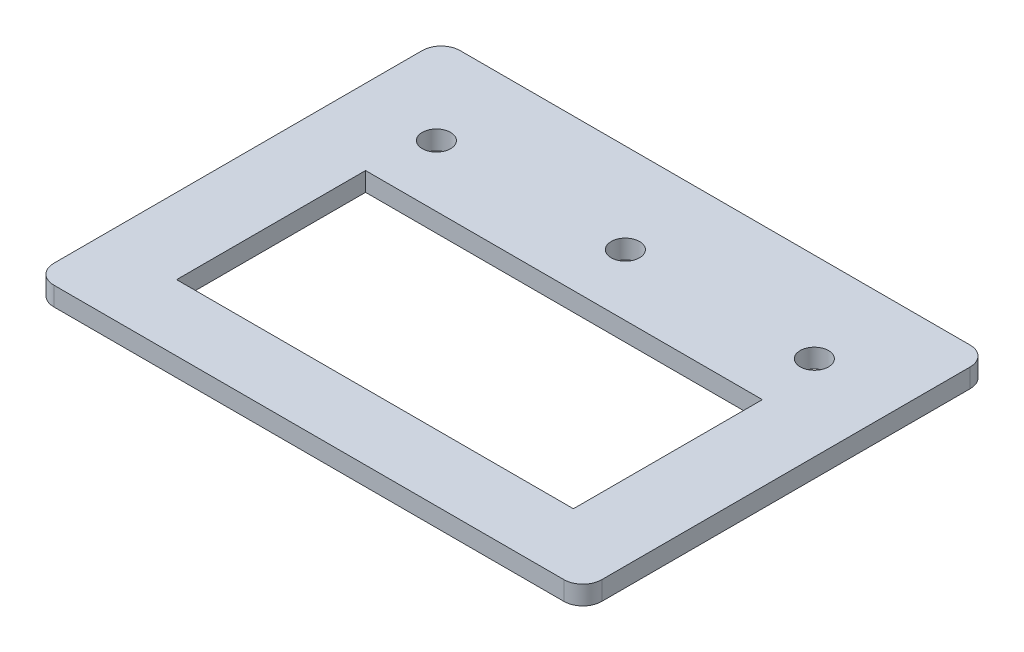
ISO-10303-21;
HEADER;
FILE_DESCRIPTION(('STEP AP214'),'2;1');
FILE_NAME('part.step','',(''),(''),'','','');
FILE_SCHEMA(('AUTOMOTIVE_DESIGN { 1 0 10303 214 1 1 1 1 }'));
ENDSEC;
DATA;
#1=APPLICATION_CONTEXT('core data for automotive mechanical design processes');
#2=APPLICATION_PROTOCOL_DEFINITION('international standard','automotive_design',2000,#1);
#3=PRODUCT_CONTEXT('',#1,'mechanical');
#4=PRODUCT('Part','Part','',(#3));
#5=PRODUCT_RELATED_PRODUCT_CATEGORY('part','',(#4));
#6=PRODUCT_DEFINITION_FORMATION('','',#4);
#7=PRODUCT_DEFINITION_CONTEXT('part definition',#1,'design');
#8=PRODUCT_DEFINITION('design','',#6,#7);
#9=PRODUCT_DEFINITION_SHAPE('','',#8);
#10=(LENGTH_UNIT() NAMED_UNIT(*) SI_UNIT(.MILLI.,.METRE.));
#11=(NAMED_UNIT(*) PLANE_ANGLE_UNIT() SI_UNIT($,.RADIAN.));
#12=(NAMED_UNIT(*) SI_UNIT($,.STERADIAN.) SOLID_ANGLE_UNIT());
#13=UNCERTAINTY_MEASURE_WITH_UNIT(LENGTH_MEASURE(1.E-05),#10,'distance_accuracy_value','');
#14=(GEOMETRIC_REPRESENTATION_CONTEXT(3) GLOBAL_UNCERTAINTY_ASSIGNED_CONTEXT((#13)) GLOBAL_UNIT_ASSIGNED_CONTEXT((#10,
#11,#12)) REPRESENTATION_CONTEXT('',''));
#15=CARTESIAN_POINT('',(0.,0.,0.));
#16=DIRECTION('',(0.,0.,1.));
#17=DIRECTION('',(1.,0.,0.));
#18=AXIS2_PLACEMENT_3D('',#15,#16,#17);
#19=CARTESIAN_POINT('',(0.,2.,0.));
#20=DIRECTION('',(0.,-1.,0.));
#21=DIRECTION('',(0.,0.,-1.));
#22=AXIS2_PLACEMENT_3D('',#19,#20,#21);
#23=PLANE('',#22);
#24=DIRECTION('',(-1.,0.,0.));
#25=VECTOR('',#24,1.);
#26=CARTESIAN_POINT('',(-29.,2.,-21.5));
#27=LINE('',#26,#25);
#28=CARTESIAN_POINT('',(27.,2.,-21.5));
#29=VERTEX_POINT('',#28);
#30=CARTESIAN_POINT('',(-27.,2.,-21.5));
#31=VERTEX_POINT('',#30);
#32=EDGE_CURVE('E190',#29,#31,#27,.T.);
#33=ORIENTED_EDGE('',*,*,#32,.T.);
#34=CARTESIAN_POINT('',(-27.,2.,-19.5));
#35=DIRECTION('',(0.,-1.,0.));
#36=DIRECTION('',(0.,0.,-1.));
#37=AXIS2_PLACEMENT_3D('',#34,#35,#36);
#38=CIRCLE('',#37,2.);
#39=CARTESIAN_POINT('',(-29.,2.,-19.5));
#40=VERTEX_POINT('',#39);
#41=EDGE_CURVE('E248',#31,#40,#38,.F.);
#42=ORIENTED_EDGE('',*,*,#41,.T.);
#43=DIRECTION('',(0.,0.,1.));
#44=VECTOR('',#43,1.);
#45=CARTESIAN_POINT('',(-29.,2.,21.5));
#46=LINE('',#45,#44);
#47=CARTESIAN_POINT('',(-29.,2.,19.5));
#48=VERTEX_POINT('',#47);
#49=EDGE_CURVE('E195',#40,#48,#46,.T.);
#50=ORIENTED_EDGE('',*,*,#49,.T.);
#51=CARTESIAN_POINT('',(-27.,2.,19.5));
#52=DIRECTION('',(0.,-1.,0.));
#53=DIRECTION('',(0.,0.,-1.));
#54=AXIS2_PLACEMENT_3D('',#51,#52,#53);
#55=CIRCLE('',#54,2.);
#56=CARTESIAN_POINT('',(-27.,2.,21.5));
#57=VERTEX_POINT('',#56);
#58=EDGE_CURVE('E60',#48,#57,#55,.F.);
#59=ORIENTED_EDGE('',*,*,#58,.T.);
#60=DIRECTION('',(1.,0.,0.));
#61=VECTOR('',#60,1.);
#62=CARTESIAN_POINT('',(-29.,2.,21.5));
#63=LINE('',#62,#61);
#64=CARTESIAN_POINT('',(27.,2.,21.5));
#65=VERTEX_POINT('',#64);
#66=EDGE_CURVE('E198',#57,#65,#63,.T.);
#67=ORIENTED_EDGE('',*,*,#66,.T.);
#68=CARTESIAN_POINT('',(27.,2.,19.5));
#69=DIRECTION('',(0.,-1.,0.));
#70=DIRECTION('',(0.,0.,-1.));
#71=AXIS2_PLACEMENT_3D('',#68,#69,#70);
#72=CIRCLE('',#71,2.);
#73=CARTESIAN_POINT('',(29.,2.,19.5));
#74=VERTEX_POINT('',#73);
#75=EDGE_CURVE('E242',#65,#74,#72,.F.);
#76=ORIENTED_EDGE('',*,*,#75,.T.);
#77=DIRECTION('',(0.,0.,-1.));
#78=VECTOR('',#77,1.);
#79=CARTESIAN_POINT('',(29.,2.,21.5));
#80=LINE('',#79,#78);
#81=CARTESIAN_POINT('',(29.,2.,-19.5));
#82=VERTEX_POINT('',#81);
#83=EDGE_CURVE('E186',#74,#82,#80,.T.);
#84=ORIENTED_EDGE('',*,*,#83,.T.);
#85=CARTESIAN_POINT('',(27.,2.,-19.5));
#86=DIRECTION('',(0.,-1.,0.));
#87=DIRECTION('',(0.,0.,-1.));
#88=AXIS2_PLACEMENT_3D('',#85,#86,#87);
#89=CIRCLE('',#88,2.);
#90=EDGE_CURVE('E245',#82,#29,#89,.F.);
#91=ORIENTED_EDGE('',*,*,#90,.T.);
#92=EDGE_LOOP('',(#33,#42,#50,#59,#67,#76,#84,#91));
#93=FACE_BOUND('',#92,.T.);
#94=DIRECTION('',(0.,0.,-1.));
#95=VECTOR('',#94,1.);
#96=CARTESIAN_POINT('',(21.,2.,-5.5));
#97=LINE('',#96,#95);
#98=CARTESIAN_POINT('',(21.,2.,14.5));
#99=VERTEX_POINT('',#98);
#100=CARTESIAN_POINT('',(21.,2.,-5.5));
#101=VERTEX_POINT('',#100);
#102=EDGE_CURVE('E130',#99,#101,#97,.T.);
#103=ORIENTED_EDGE('',*,*,#102,.F.);
#104=DIRECTION('',(1.,0.,0.));
#105=VECTOR('',#104,1.);
#106=CARTESIAN_POINT('',(-21.,2.,14.5));
#107=LINE('',#106,#105);
#108=CARTESIAN_POINT('',(-21.,2.,14.5));
#109=VERTEX_POINT('',#108);
#110=EDGE_CURVE('E160',#109,#99,#107,.T.);
#111=ORIENTED_EDGE('',*,*,#110,.F.);
#112=DIRECTION('',(0.,0.,1.));
#113=VECTOR('',#112,1.);
#114=CARTESIAN_POINT('',(-21.,2.,-5.5));
#115=LINE('',#114,#113);
#116=CARTESIAN_POINT('',(-21.,2.,-5.5));
#117=VERTEX_POINT('',#116);
#118=EDGE_CURVE('E156',#117,#109,#115,.T.);
#119=ORIENTED_EDGE('',*,*,#118,.F.);
#120=DIRECTION('',(-1.,0.,0.));
#121=VECTOR('',#120,1.);
#122=CARTESIAN_POINT('',(-21.,2.,-5.5));
#123=LINE('',#122,#121);
#124=EDGE_CURVE('E141',#101,#117,#123,.T.);
#125=ORIENTED_EDGE('',*,*,#124,.F.);
#126=EDGE_LOOP('',(#103,#111,#119,#125));
#127=FACE_BOUND('',#126,.T.);
#128=CARTESIAN_POINT('',(0.,2.,-12.));
#129=DIRECTION('',(0.,1.,0.));
#130=DIRECTION('',(0.,0.,1.));
#131=AXIS2_PLACEMENT_3D('',#128,#129,#130);
#132=CIRCLE('',#131,1.5);
#133=CARTESIAN_POINT('',(0.,2.,-10.5));
#134=VERTEX_POINT('',#133);
#135=EDGE_CURVE('E169',#134,#134,#132,.T.);
#136=ORIENTED_EDGE('',*,*,#135,.F.);
#137=EDGE_LOOP('',(#136));
#138=FACE_BOUND('',#137,.T.);
#139=CARTESIAN_POINT('',(20.,2.,-12.));
#140=DIRECTION('',(0.,1.,0.));
#141=DIRECTION('',(0.,0.,1.));
#142=AXIS2_PLACEMENT_3D('',#139,#140,#141);
#143=CIRCLE('',#142,1.5);
#144=CARTESIAN_POINT('',(20.,2.,-10.5));
#145=VERTEX_POINT('',#144);
#146=EDGE_CURVE('E448',#145,#145,#143,.T.);
#147=ORIENTED_EDGE('',*,*,#146,.F.);
#148=EDGE_LOOP('',(#147));
#149=FACE_BOUND('',#148,.T.);
#150=CARTESIAN_POINT('',(-20.,2.,-12.));
#151=DIRECTION('',(0.,1.,0.));
#152=DIRECTION('',(0.,0.,1.));
#153=AXIS2_PLACEMENT_3D('',#150,#151,#152);
#154=CIRCLE('',#153,1.5);
#155=CARTESIAN_POINT('',(-20.,2.,-10.5));
#156=VERTEX_POINT('',#155);
#157=EDGE_CURVE('E458',#156,#156,#154,.T.);
#158=ORIENTED_EDGE('',*,*,#157,.F.);
#159=EDGE_LOOP('',(#158));
#160=FACE_BOUND('',#159,.T.);
#161=ADVANCED_FACE('F39',(#93,#127,#138,#149,#160),#23,.F.);
#162=CARTESIAN_POINT('',(0.,0.,0.));
#163=DIRECTION('',(0.,-1.,0.));
#164=DIRECTION('',(0.,0.,-1.));
#165=AXIS2_PLACEMENT_3D('',#162,#163,#164);
#166=PLANE('',#165);
#167=CARTESIAN_POINT('',(20.,0.,-12.));
#168=DIRECTION('',(0.,1.,0.));
#169=DIRECTION('',(0.,0.,1.));
#170=AXIS2_PLACEMENT_3D('',#167,#168,#169);
#171=CIRCLE('',#170,1.5);
#172=CARTESIAN_POINT('',(20.,0.,-10.5));
#173=VERTEX_POINT('',#172);
#174=EDGE_CURVE('E453',#173,#173,#171,.T.);
#175=ORIENTED_EDGE('',*,*,#174,.T.);
#176=EDGE_LOOP('',(#175));
#177=FACE_BOUND('',#176,.T.);
#178=DIRECTION('',(1.,0.,0.));
#179=VECTOR('',#178,1.);
#180=CARTESIAN_POINT('',(-21.,0.,14.5));
#181=LINE('',#180,#179);
#182=CARTESIAN_POINT('',(-21.,0.,14.5));
#183=VERTEX_POINT('',#182);
#184=CARTESIAN_POINT('',(21.,0.,14.5));
#185=VERTEX_POINT('',#184);
#186=EDGE_CURVE('E142',#183,#185,#181,.T.);
#187=ORIENTED_EDGE('',*,*,#186,.T.);
#188=DIRECTION('',(0.,0.,-1.));
#189=VECTOR('',#188,1.);
#190=CARTESIAN_POINT('',(21.,0.,-5.5));
#191=LINE('',#190,#189);
#192=CARTESIAN_POINT('',(21.,0.,-5.5));
#193=VERTEX_POINT('',#192);
#194=EDGE_CURVE('E166',#185,#193,#191,.T.);
#195=ORIENTED_EDGE('',*,*,#194,.T.);
#196=DIRECTION('',(-1.,0.,0.));
#197=VECTOR('',#196,1.);
#198=CARTESIAN_POINT('',(-21.,0.,-5.5));
#199=LINE('',#198,#197);
#200=CARTESIAN_POINT('',(-21.,0.,-5.5));
#201=VERTEX_POINT('',#200);
#202=EDGE_CURVE('E148',#193,#201,#199,.T.);
#203=ORIENTED_EDGE('',*,*,#202,.T.);
#204=DIRECTION('',(0.,0.,1.));
#205=VECTOR('',#204,1.);
#206=CARTESIAN_POINT('',(-21.,0.,-5.5));
#207=LINE('',#206,#205);
#208=EDGE_CURVE('E172',#201,#183,#207,.T.);
#209=ORIENTED_EDGE('',*,*,#208,.T.);
#210=EDGE_LOOP('',(#187,#195,#203,#209));
#211=FACE_BOUND('',#210,.T.);
#212=DIRECTION('',(0.,0.,1.));
#213=VECTOR('',#212,1.);
#214=CARTESIAN_POINT('',(-29.,0.,21.5));
#215=LINE('',#214,#213);
#216=CARTESIAN_POINT('',(-29.,0.,-19.5));
#217=VERTEX_POINT('',#216);
#218=CARTESIAN_POINT('',(-29.,0.,19.5));
#219=VERTEX_POINT('',#218);
#220=EDGE_CURVE('E209',#217,#219,#215,.T.);
#221=ORIENTED_EDGE('',*,*,#220,.F.);
#222=CARTESIAN_POINT('',(-27.,0.,-19.5));
#223=DIRECTION('',(0.,-1.,0.));
#224=DIRECTION('',(0.,0.,-1.));
#225=AXIS2_PLACEMENT_3D('',#222,#223,#224);
#226=CIRCLE('',#225,2.);
#227=CARTESIAN_POINT('',(-27.,0.,-21.5));
#228=VERTEX_POINT('',#227);
#229=EDGE_CURVE('E230',#217,#228,#226,.T.);
#230=ORIENTED_EDGE('',*,*,#229,.T.);
#231=DIRECTION('',(-1.,0.,0.));
#232=VECTOR('',#231,1.);
#233=CARTESIAN_POINT('',(-29.,0.,-21.5));
#234=LINE('',#233,#232);
#235=CARTESIAN_POINT('',(27.,0.,-21.5));
#236=VERTEX_POINT('',#235);
#237=EDGE_CURVE('E205',#236,#228,#234,.T.);
#238=ORIENTED_EDGE('',*,*,#237,.F.);
#239=CARTESIAN_POINT('',(27.,0.,-19.5));
#240=DIRECTION('',(0.,-1.,0.));
#241=DIRECTION('',(0.,0.,-1.));
#242=AXIS2_PLACEMENT_3D('',#239,#240,#241);
#243=CIRCLE('',#242,2.);
#244=CARTESIAN_POINT('',(29.,0.,-19.5));
#245=VERTEX_POINT('',#244);
#246=EDGE_CURVE('E227',#236,#245,#243,.T.);
#247=ORIENTED_EDGE('',*,*,#246,.T.);
#248=DIRECTION('',(0.,0.,-1.));
#249=VECTOR('',#248,1.);
#250=CARTESIAN_POINT('',(29.,0.,21.5));
#251=LINE('',#250,#249);
#252=CARTESIAN_POINT('',(29.,0.,19.5));
#253=VERTEX_POINT('',#252);
#254=EDGE_CURVE('E150',#253,#245,#251,.T.);
#255=ORIENTED_EDGE('',*,*,#254,.F.);
#256=CARTESIAN_POINT('',(27.,0.,19.5));
#257=DIRECTION('',(0.,-1.,0.));
#258=DIRECTION('',(0.,0.,-1.));
#259=AXIS2_PLACEMENT_3D('',#256,#257,#258);
#260=CIRCLE('',#259,2.);
#261=CARTESIAN_POINT('',(27.,0.,21.5));
#262=VERTEX_POINT('',#261);
#263=EDGE_CURVE('E224',#253,#262,#260,.T.);
#264=ORIENTED_EDGE('',*,*,#263,.T.);
#265=DIRECTION('',(1.,0.,0.));
#266=VECTOR('',#265,1.);
#267=CARTESIAN_POINT('',(-29.,0.,21.5));
#268=LINE('',#267,#266);
#269=CARTESIAN_POINT('',(-27.,0.,21.5));
#270=VERTEX_POINT('',#269);
#271=EDGE_CURVE('E191',#270,#262,#268,.T.);
#272=ORIENTED_EDGE('',*,*,#271,.F.);
#273=CARTESIAN_POINT('',(-27.,0.,19.5));
#274=DIRECTION('',(0.,-1.,0.));
#275=DIRECTION('',(0.,0.,-1.));
#276=AXIS2_PLACEMENT_3D('',#273,#274,#275);
#277=CIRCLE('',#276,2.);
#278=EDGE_CURVE('E221',#270,#219,#277,.T.);
#279=ORIENTED_EDGE('',*,*,#278,.T.);
#280=EDGE_LOOP('',(#221,#230,#238,#247,#255,#264,#272,#279));
#281=FACE_BOUND('',#280,.T.);
#282=CARTESIAN_POINT('',(0.,0.,-12.));
#283=DIRECTION('',(0.,1.,0.));
#284=DIRECTION('',(0.,0.,1.));
#285=AXIS2_PLACEMENT_3D('',#282,#283,#284);
#286=CIRCLE('',#285,1.5);
#287=CARTESIAN_POINT('',(0.,0.,-10.5));
#288=VERTEX_POINT('',#287);
#289=EDGE_CURVE('E446',#288,#288,#286,.T.);
#290=ORIENTED_EDGE('',*,*,#289,.T.);
#291=EDGE_LOOP('',(#290));
#292=FACE_BOUND('',#291,.T.);
#293=CARTESIAN_POINT('',(-20.,0.,-12.));
#294=DIRECTION('',(0.,1.,0.));
#295=DIRECTION('',(0.,0.,1.));
#296=AXIS2_PLACEMENT_3D('',#293,#294,#295);
#297=CIRCLE('',#296,1.5);
#298=CARTESIAN_POINT('',(-20.,0.,-10.5));
#299=VERTEX_POINT('',#298);
#300=EDGE_CURVE('E460',#299,#299,#297,.T.);
#301=ORIENTED_EDGE('',*,*,#300,.T.);
#302=EDGE_LOOP('',(#301));
#303=FACE_BOUND('',#302,.T.);
#304=ADVANCED_FACE('F265',(#177,#211,#281,#292,#303),#166,.T.);
#305=CARTESIAN_POINT('',(29.,2.,21.5));
#306=DIRECTION('',(-1.,0.,0.));
#307=DIRECTION('',(0.,0.,1.));
#308=AXIS2_PLACEMENT_3D('',#305,#306,#307);
#309=PLANE('',#308);
#310=ORIENTED_EDGE('',*,*,#254,.T.);
#311=DIRECTION('',(0.,-1.,0.));
#312=VECTOR('',#311,1.);
#313=CARTESIAN_POINT('',(29.,2.,-19.5));
#314=LINE('',#313,#312);
#315=EDGE_CURVE('E255',#245,#82,#314,.F.);
#316=ORIENTED_EDGE('',*,*,#315,.T.);
#317=ORIENTED_EDGE('',*,*,#83,.F.);
#318=DIRECTION('',(0.,-1.,0.));
#319=VECTOR('',#318,1.);
#320=CARTESIAN_POINT('',(29.,2.,19.5));
#321=LINE('',#320,#319);
#322=EDGE_CURVE('E251',#74,#253,#321,.T.);
#323=ORIENTED_EDGE('',*,*,#322,.T.);
#324=EDGE_LOOP('',(#310,#316,#317,#323));
#325=FACE_BOUND('',#324,.T.);
#326=ADVANCED_FACE('F274',(#325),#309,.F.);
#327=CARTESIAN_POINT('',(-29.,2.,-21.5));
#328=DIRECTION('',(0.,0.,1.));
#329=DIRECTION('',(1.,0.,0.));
#330=AXIS2_PLACEMENT_3D('',#327,#328,#329);
#331=PLANE('',#330);
#332=ORIENTED_EDGE('',*,*,#237,.T.);
#333=DIRECTION('',(0.,-1.,0.));
#334=VECTOR('',#333,1.);
#335=CARTESIAN_POINT('',(-27.,2.,-21.5));
#336=LINE('',#335,#334);
#337=EDGE_CURVE('E237',#228,#31,#336,.F.);
#338=ORIENTED_EDGE('',*,*,#337,.T.);
#339=ORIENTED_EDGE('',*,*,#32,.F.);
#340=DIRECTION('',(0.,-1.,0.));
#341=VECTOR('',#340,1.);
#342=CARTESIAN_POINT('',(27.,2.,-21.5));
#343=LINE('',#342,#341);
#344=EDGE_CURVE('E233',#29,#236,#343,.T.);
#345=ORIENTED_EDGE('',*,*,#344,.T.);
#346=EDGE_LOOP('',(#332,#338,#339,#345));
#347=FACE_BOUND('',#346,.T.);
#348=ADVANCED_FACE('F283',(#347),#331,.F.);
#349=CARTESIAN_POINT('',(-29.,2.,21.5));
#350=DIRECTION('',(1.,0.,0.));
#351=DIRECTION('',(0.,0.,-1.));
#352=AXIS2_PLACEMENT_3D('',#349,#350,#351);
#353=PLANE('',#352);
#354=ORIENTED_EDGE('',*,*,#49,.F.);
#355=DIRECTION('',(0.,-1.,0.));
#356=VECTOR('',#355,1.);
#357=CARTESIAN_POINT('',(-29.,2.,-19.5));
#358=LINE('',#357,#356);
#359=EDGE_CURVE('E217',#40,#217,#358,.T.);
#360=ORIENTED_EDGE('',*,*,#359,.T.);
#361=ORIENTED_EDGE('',*,*,#220,.T.);
#362=DIRECTION('',(0.,-1.,0.));
#363=VECTOR('',#362,1.);
#364=CARTESIAN_POINT('',(-29.,2.,19.5));
#365=LINE('',#364,#363);
#366=EDGE_CURVE('E201',#219,#48,#365,.F.);
#367=ORIENTED_EDGE('',*,*,#366,.T.);
#368=EDGE_LOOP('',(#354,#360,#361,#367));
#369=FACE_BOUND('',#368,.T.);
#370=ADVANCED_FACE('F291',(#369),#353,.F.);
#371=CARTESIAN_POINT('',(-29.,2.,21.5));
#372=DIRECTION('',(0.,0.,-1.));
#373=DIRECTION('',(-1.,0.,0.));
#374=AXIS2_PLACEMENT_3D('',#371,#372,#373);
#375=PLANE('',#374);
#376=ORIENTED_EDGE('',*,*,#271,.T.);
#377=DIRECTION('',(0.,-1.,0.));
#378=VECTOR('',#377,1.);
#379=CARTESIAN_POINT('',(27.,2.,21.5));
#380=LINE('',#379,#378);
#381=EDGE_CURVE('E11',#262,#65,#380,.F.);
#382=ORIENTED_EDGE('',*,*,#381,.T.);
#383=ORIENTED_EDGE('',*,*,#66,.F.);
#384=DIRECTION('',(0.,-1.,0.));
#385=VECTOR('',#384,1.);
#386=CARTESIAN_POINT('',(-27.,2.,21.5));
#387=LINE('',#386,#385);
#388=EDGE_CURVE('E48',#57,#270,#387,.T.);
#389=ORIENTED_EDGE('',*,*,#388,.T.);
#390=EDGE_LOOP('',(#376,#382,#383,#389));
#391=FACE_BOUND('',#390,.T.);
#392=ADVANCED_FACE('F261',(#391),#375,.F.);
#393=CARTESIAN_POINT('',(21.,2.,-5.5));
#394=DIRECTION('',(-1.,0.,0.));
#395=DIRECTION('',(0.,0.,1.));
#396=AXIS2_PLACEMENT_3D('',#393,#394,#395);
#397=PLANE('',#396);
#398=ORIENTED_EDGE('',*,*,#194,.F.);
#399=DIRECTION('',(0.,-1.,0.));
#400=VECTOR('',#399,1.);
#401=CARTESIAN_POINT('',(21.,2.,14.5));
#402=LINE('',#401,#400);
#403=EDGE_CURVE('E136',#99,#185,#402,.T.);
#404=ORIENTED_EDGE('',*,*,#403,.F.);
#405=ORIENTED_EDGE('',*,*,#102,.T.);
#406=DIRECTION('',(0.,-1.,0.));
#407=VECTOR('',#406,1.);
#408=CARTESIAN_POINT('',(21.,2.,-5.5));
#409=LINE('',#408,#407);
#410=EDGE_CURVE('E133',#101,#193,#409,.T.);
#411=ORIENTED_EDGE('',*,*,#410,.T.);
#412=EDGE_LOOP('',(#398,#404,#405,#411));
#413=FACE_BOUND('',#412,.T.);
#414=ADVANCED_FACE('F132',(#413),#397,.T.);
#415=CARTESIAN_POINT('',(-21.,2.,-5.5));
#416=DIRECTION('',(0.,0.,1.));
#417=DIRECTION('',(1.,0.,0.));
#418=AXIS2_PLACEMENT_3D('',#415,#416,#417);
#419=PLANE('',#418);
#420=ORIENTED_EDGE('',*,*,#202,.F.);
#421=ORIENTED_EDGE('',*,*,#410,.F.);
#422=ORIENTED_EDGE('',*,*,#124,.T.);
#423=DIRECTION('',(0.,-1.,0.));
#424=VECTOR('',#423,1.);
#425=CARTESIAN_POINT('',(-21.,2.,-5.5));
#426=LINE('',#425,#424);
#427=EDGE_CURVE('E151',#117,#201,#426,.T.);
#428=ORIENTED_EDGE('',*,*,#427,.T.);
#429=EDGE_LOOP('',(#420,#421,#422,#428));
#430=FACE_BOUND('',#429,.T.);
#431=ADVANCED_FACE('F145',(#430),#419,.T.);
#432=CARTESIAN_POINT('',(-21.,2.,-5.5));
#433=DIRECTION('',(1.,0.,0.));
#434=DIRECTION('',(0.,0.,-1.));
#435=AXIS2_PLACEMENT_3D('',#432,#433,#434);
#436=PLANE('',#435);
#437=ORIENTED_EDGE('',*,*,#208,.F.);
#438=ORIENTED_EDGE('',*,*,#427,.F.);
#439=ORIENTED_EDGE('',*,*,#118,.T.);
#440=DIRECTION('',(0.,-1.,0.));
#441=VECTOR('',#440,1.);
#442=CARTESIAN_POINT('',(-21.,2.,14.5));
#443=LINE('',#442,#441);
#444=EDGE_CURVE('E181',#109,#183,#443,.T.);
#445=ORIENTED_EDGE('',*,*,#444,.T.);
#446=EDGE_LOOP('',(#437,#438,#439,#445));
#447=FACE_BOUND('',#446,.T.);
#448=ADVANCED_FACE('F375',(#447),#436,.T.);
#449=CARTESIAN_POINT('',(-21.,2.,14.5));
#450=DIRECTION('',(0.,0.,-1.));
#451=DIRECTION('',(-1.,0.,0.));
#452=AXIS2_PLACEMENT_3D('',#449,#450,#451);
#453=PLANE('',#452);
#454=ORIENTED_EDGE('',*,*,#186,.F.);
#455=ORIENTED_EDGE('',*,*,#444,.F.);
#456=ORIENTED_EDGE('',*,*,#110,.T.);
#457=ORIENTED_EDGE('',*,*,#403,.T.);
#458=EDGE_LOOP('',(#454,#455,#456,#457));
#459=FACE_BOUND('',#458,.T.);
#460=ADVANCED_FACE('F366',(#459),#453,.T.);
#461=CARTESIAN_POINT('',(0.,2.,-12.));
#462=DIRECTION('',(0.,-1.,0.));
#463=DIRECTION('',(0.,0.,-1.));
#464=AXIS2_PLACEMENT_3D('',#461,#462,#463);
#465=CYLINDRICAL_SURFACE('',#464,1.5);
#466=ORIENTED_EDGE('',*,*,#135,.T.);
#467=EDGE_LOOP('',(#466));
#468=FACE_BOUND('',#467,.T.);
#469=ORIENTED_EDGE('',*,*,#289,.F.);
#470=EDGE_LOOP('',(#469));
#471=FACE_BOUND('',#470,.T.);
#472=ADVANCED_FACE('F357',(#468,#471),#465,.F.);
#473=CARTESIAN_POINT('',(20.,2.,-12.));
#474=DIRECTION('',(0.,-1.,0.));
#475=DIRECTION('',(0.,0.,-1.));
#476=AXIS2_PLACEMENT_3D('',#473,#474,#475);
#477=CYLINDRICAL_SURFACE('',#476,1.5);
#478=ORIENTED_EDGE('',*,*,#146,.T.);
#479=EDGE_LOOP('',(#478));
#480=FACE_BOUND('',#479,.T.);
#481=ORIENTED_EDGE('',*,*,#174,.F.);
#482=EDGE_LOOP('',(#481));
#483=FACE_BOUND('',#482,.T.);
#484=ADVANCED_FACE('F348',(#480,#483),#477,.F.);
#485=CARTESIAN_POINT('',(-20.,2.,-12.));
#486=DIRECTION('',(0.,-1.,0.));
#487=DIRECTION('',(0.,0.,-1.));
#488=AXIS2_PLACEMENT_3D('',#485,#486,#487);
#489=CYLINDRICAL_SURFACE('',#488,1.5);
#490=ORIENTED_EDGE('',*,*,#157,.T.);
#491=EDGE_LOOP('',(#490));
#492=FACE_BOUND('',#491,.T.);
#493=ORIENTED_EDGE('',*,*,#300,.F.);
#494=EDGE_LOOP('',(#493));
#495=FACE_BOUND('',#494,.T.);
#496=ADVANCED_FACE('F317',(#492,#495),#489,.F.);
#497=CARTESIAN_POINT('',(-27.,2.,-19.5));
#498=DIRECTION('',(0.,-1.,0.));
#499=DIRECTION('',(0.,0.,-1.));
#500=AXIS2_PLACEMENT_3D('',#497,#498,#499);
#501=CYLINDRICAL_SURFACE('',#500,2.);
#502=ORIENTED_EDGE('',*,*,#41,.F.);
#503=ORIENTED_EDGE('',*,*,#337,.F.);
#504=ORIENTED_EDGE('',*,*,#229,.F.);
#505=ORIENTED_EDGE('',*,*,#359,.F.);
#506=EDGE_LOOP('',(#502,#503,#504,#505));
#507=FACE_BOUND('',#506,.T.);
#508=ADVANCED_FACE('F288',(#507),#501,.T.);
#509=CARTESIAN_POINT('',(27.,2.,-19.5));
#510=DIRECTION('',(0.,-1.,0.));
#511=DIRECTION('',(0.,0.,-1.));
#512=AXIS2_PLACEMENT_3D('',#509,#510,#511);
#513=CYLINDRICAL_SURFACE('',#512,2.);
#514=ORIENTED_EDGE('',*,*,#90,.F.);
#515=ORIENTED_EDGE('',*,*,#315,.F.);
#516=ORIENTED_EDGE('',*,*,#246,.F.);
#517=ORIENTED_EDGE('',*,*,#344,.F.);
#518=EDGE_LOOP('',(#514,#515,#516,#517));
#519=FACE_BOUND('',#518,.T.);
#520=ADVANCED_FACE('F280',(#519),#513,.T.);
#521=CARTESIAN_POINT('',(27.,2.,19.5));
#522=DIRECTION('',(0.,-1.,0.));
#523=DIRECTION('',(0.,0.,-1.));
#524=AXIS2_PLACEMENT_3D('',#521,#522,#523);
#525=CYLINDRICAL_SURFACE('',#524,2.);
#526=ORIENTED_EDGE('',*,*,#75,.F.);
#527=ORIENTED_EDGE('',*,*,#381,.F.);
#528=ORIENTED_EDGE('',*,*,#263,.F.);
#529=ORIENTED_EDGE('',*,*,#322,.F.);
#530=EDGE_LOOP('',(#526,#527,#528,#529));
#531=FACE_BOUND('',#530,.T.);
#532=ADVANCED_FACE('F271',(#531),#525,.T.);
#533=CARTESIAN_POINT('',(-27.,2.,19.5));
#534=DIRECTION('',(0.,-1.,0.));
#535=DIRECTION('',(0.,0.,-1.));
#536=AXIS2_PLACEMENT_3D('',#533,#534,#535);
#537=CYLINDRICAL_SURFACE('',#536,2.);
#538=ORIENTED_EDGE('',*,*,#58,.F.);
#539=ORIENTED_EDGE('',*,*,#366,.F.);
#540=ORIENTED_EDGE('',*,*,#278,.F.);
#541=ORIENTED_EDGE('',*,*,#388,.F.);
#542=EDGE_LOOP('',(#538,#539,#540,#541));
#543=FACE_BOUND('',#542,.T.);
#544=ADVANCED_FACE('F41',(#543),#537,.T.);
#545=CLOSED_SHELL('',(#161,#304,#326,#348,#370,#392,#414,#431,#448,#460,#472,#484,#496,#508,
#520,#532,#544));
#546=MANIFOLD_SOLID_BREP('B2',#545);
#547=ADVANCED_BREP_SHAPE_REPRESENTATION('',(#18,#546),#14);
#548=SHAPE_DEFINITION_REPRESENTATION(#9,#547);
ENDSEC;
END-ISO-10303-21;
